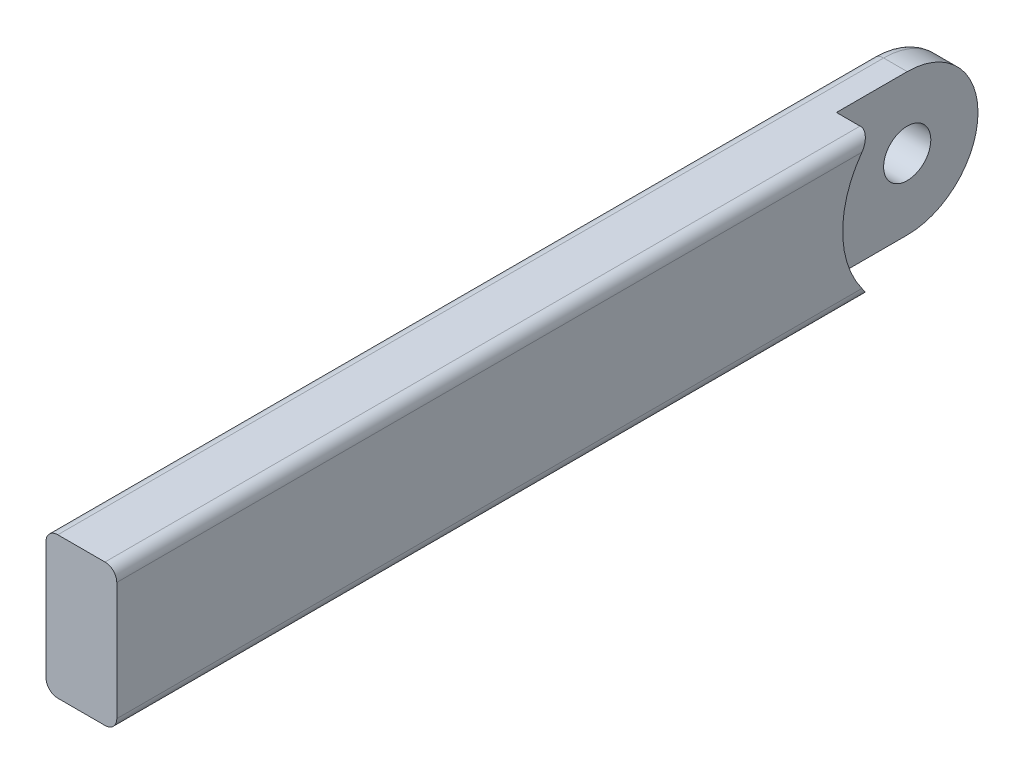
ISO-10303-21;
HEADER;
FILE_DESCRIPTION(('STEP AP214'),'2;1');
FILE_NAME('part.step','',(''),(''),'','','');
FILE_SCHEMA(('AUTOMOTIVE_DESIGN { 1 0 10303 214 1 1 1 1 }'));
ENDSEC;
DATA;
#1=APPLICATION_CONTEXT('core data for automotive mechanical design processes');
#2=APPLICATION_PROTOCOL_DEFINITION('international standard','automotive_design',2000,#1);
#3=PRODUCT_CONTEXT('',#1,'mechanical');
#4=PRODUCT('Part','Part','',(#3));
#5=PRODUCT_RELATED_PRODUCT_CATEGORY('part','',(#4));
#6=PRODUCT_DEFINITION_FORMATION('','',#4);
#7=PRODUCT_DEFINITION_CONTEXT('part definition',#1,'design');
#8=PRODUCT_DEFINITION('design','',#6,#7);
#9=PRODUCT_DEFINITION_SHAPE('','',#8);
#10=(LENGTH_UNIT() NAMED_UNIT(*) SI_UNIT(.MILLI.,.METRE.));
#11=(NAMED_UNIT(*) PLANE_ANGLE_UNIT() SI_UNIT($,.RADIAN.));
#12=(NAMED_UNIT(*) SI_UNIT($,.STERADIAN.) SOLID_ANGLE_UNIT());
#13=UNCERTAINTY_MEASURE_WITH_UNIT(LENGTH_MEASURE(1.E-05),#10,'distance_accuracy_value','');
#14=(GEOMETRIC_REPRESENTATION_CONTEXT(3) GLOBAL_UNCERTAINTY_ASSIGNED_CONTEXT((#13)) GLOBAL_UNIT_ASSIGNED_CONTEXT((#10,
#11,#12)) REPRESENTATION_CONTEXT('',''));
#15=CARTESIAN_POINT('',(0.,0.,0.));
#16=DIRECTION('',(0.,0.,1.));
#17=DIRECTION('',(1.,0.,0.));
#18=AXIS2_PLACEMENT_3D('',#15,#16,#17);
#19=CARTESIAN_POINT('',(0.,0.,0.101351351351291));
#20=DIRECTION('',(0.,0.,-1.));
#21=DIRECTION('',(-1.,0.,0.));
#22=AXIS2_PLACEMENT_3D('',#19,#20,#21);
#23=PLANE('',#22);
#24=DIRECTION('',(-1.,0.,0.));
#25=VECTOR('',#24,1.);
#26=CARTESIAN_POINT('',(11.0472972972973,0.0525401307242337,0.101351351351291));
#27=LINE('',#26,#25);
#28=CARTESIAN_POINT('',(-18.9527027027027,0.0525401307242337,0.101351351351291));
#29=VERTEX_POINT('',#28);
#30=CARTESIAN_POINT('',(-13.4428594049291,0.0525401307242337,0.101351351351291));
#31=VERTEX_POINT('',#30);
#32=EDGE_CURVE('E139',#29,#31,#27,.F.);
#33=ORIENTED_EDGE('',*,*,#32,.T.);
#34=CARTESIAN_POINT('',(-13.9527027027027,2.5,0.101351351351291));
#35=DIRECTION('',(0.,0.,-1.));
#36=DIRECTION('',(-1.,0.,0.));
#37=AXIS2_PLACEMENT_3D('',#34,#35,#36);
#38=CIRCLE('',#37,2.5);
#39=CARTESIAN_POINT('',(-13.9527027027027,0.,0.101351351351291));
#40=VERTEX_POINT('',#39);
#41=EDGE_CURVE('E314',#31,#40,#38,.T.);
#42=ORIENTED_EDGE('',*,*,#41,.T.);
#43=DIRECTION('',(-1.,0.,0.));
#44=VECTOR('',#43,1.);
#45=CARTESIAN_POINT('',(-11.4527027027027,0.,0.101351351351291));
#46=LINE('',#45,#44);
#47=CARTESIAN_POINT('',(-18.9527027027027,0.,0.101351351351291));
#48=VERTEX_POINT('',#47);
#49=EDGE_CURVE('E155',#40,#48,#46,.T.);
#50=ORIENTED_EDGE('',*,*,#49,.T.);
#51=DIRECTION('',(0.,1.,0.));
#52=VECTOR('',#51,1.);
#53=CARTESIAN_POINT('',(-18.9527027027027,30.,0.101351351351291));
#54=LINE('',#53,#52);
#55=EDGE_CURVE('E154',#48,#29,#54,.T.);
#56=ORIENTED_EDGE('',*,*,#55,.T.);
#57=EDGE_LOOP('',(#33,#42,#50,#56));
#58=FACE_BOUND('',#57,.T.);
#59=ADVANCED_FACE('F32',(#58),#23,.T.);
#60=DIRECTION('',(1.,0.,0.));
#61=VECTOR('',#60,1.);
#62=CARTESIAN_POINT('',(-11.4527027027027,30.,0.101351351351291));
#63=LINE('',#62,#61);
#64=CARTESIAN_POINT('',(-18.9527027027027,30.,0.101351351351291));
#65=VERTEX_POINT('',#64);
#66=CARTESIAN_POINT('',(-13.9527027027027,30.,0.101351351351291));
#67=VERTEX_POINT('',#66);
#68=EDGE_CURVE('E157',#65,#67,#63,.T.);
#69=ORIENTED_EDGE('',*,*,#68,.T.);
#70=CARTESIAN_POINT('',(-13.9527027027027,27.5,0.101351351351291));
#71=DIRECTION('',(0.,0.,-1.));
#72=DIRECTION('',(-1.,0.,0.));
#73=AXIS2_PLACEMENT_3D('',#70,#71,#72);
#74=CIRCLE('',#73,2.5);
#75=CARTESIAN_POINT('',(-13.4428594049291,29.9474598692758,0.101351351351291));
#76=VERTEX_POINT('',#75);
#77=EDGE_CURVE('E11',#67,#76,#74,.T.);
#78=ORIENTED_EDGE('',*,*,#77,.T.);
#79=DIRECTION('',(-1.,0.,0.));
#80=VECTOR('',#79,1.);
#81=CARTESIAN_POINT('',(11.0472972972973,29.9474598692758,0.101351351351291));
#82=LINE('',#81,#80);
#83=CARTESIAN_POINT('',(-18.9527027027027,29.9474598692758,0.101351351351291));
#84=VERTEX_POINT('',#83);
#85=EDGE_CURVE('E132',#76,#84,#82,.T.);
#86=ORIENTED_EDGE('',*,*,#85,.T.);
#87=EDGE_CURVE('E137',#84,#65,#54,.T.);
#88=ORIENTED_EDGE('',*,*,#87,.T.);
#89=EDGE_LOOP('',(#69,#78,#86,#88));
#90=FACE_BOUND('',#89,.T.);
#91=ADVANCED_FACE('F135',(#90),#23,.T.);
#92=CARTESIAN_POINT('',(-11.4527027027027,30.,-29.8986486486487));
#93=DIRECTION('',(-1.,0.,0.));
#94=DIRECTION('',(0.,0.,1.));
#95=AXIS2_PLACEMENT_3D('',#92,#93,#94);
#96=PLANE('',#95);
#97=DIRECTION('',(0.,-1.,0.));
#98=VECTOR('',#97,1.);
#99=CARTESIAN_POINT('',(-11.4527027027027,30.,160.101351351351));
#100=LINE('',#99,#98);
#101=CARTESIAN_POINT('',(-11.4527027027027,27.5,160.101351351351));
#102=VERTEX_POINT('',#101);
#103=CARTESIAN_POINT('',(-11.4527027027027,2.5,160.101351351351));
#104=VERTEX_POINT('',#103);
#105=EDGE_CURVE('E171',#102,#104,#100,.T.);
#106=ORIENTED_EDGE('',*,*,#105,.T.);
#107=DIRECTION('',(0.,0.,-1.));
#108=VECTOR('',#107,1.);
#109=CARTESIAN_POINT('',(-11.4527027027027,2.5,-29.8986486486487));
#110=LINE('',#109,#108);
#111=CARTESIAN_POINT('',(-11.4527027027027,2.5,2.19452415641032));
#112=VERTEX_POINT('',#111);
#113=EDGE_CURVE('E219',#104,#112,#110,.T.);
#114=ORIENTED_EDGE('',*,*,#113,.T.);
#115=CARTESIAN_POINT('',(-11.4527027027027,15.,-14.8986486486487));
#116=DIRECTION('',(-1.,0.,0.));
#117=DIRECTION('',(0.,0.,1.));
#118=AXIS2_PLACEMENT_3D('',#115,#116,#117);
#119=CIRCLE('',#118,21.176084542323);
#120=CARTESIAN_POINT('',(-11.4527027027027,27.5,2.19452415641031));
#121=VERTEX_POINT('',#120);
#122=EDGE_CURVE('E147',#121,#112,#119,.F.);
#123=ORIENTED_EDGE('',*,*,#122,.F.);
#124=DIRECTION('',(0.,0.,-1.));
#125=VECTOR('',#124,1.);
#126=CARTESIAN_POINT('',(-11.4527027027027,27.5,160.101351351351));
#127=LINE('',#126,#125);
#128=EDGE_CURVE('E217',#121,#102,#127,.F.);
#129=ORIENTED_EDGE('',*,*,#128,.T.);
#130=EDGE_LOOP('',(#106,#114,#123,#129));
#131=FACE_BOUND('',#130,.T.);
#132=ADVANCED_FACE('F265',(#131),#96,.F.);
#133=CARTESIAN_POINT('',(-26.4527027027027,30.,-29.8986486486487));
#134=DIRECTION('',(1.,0.,0.));
#135=DIRECTION('',(0.,0.,-1.));
#136=AXIS2_PLACEMENT_3D('',#133,#134,#135);
#137=PLANE('',#136);
#138=CARTESIAN_POINT('',(-26.4527027027027,15.,-14.8986486486487));
#139=DIRECTION('',(1.,0.,0.));
#140=DIRECTION('',(0.,0.,-1.));
#141=AXIS2_PLACEMENT_3D('',#138,#139,#140);
#142=CIRCLE('',#141,5.);
#143=CARTESIAN_POINT('',(-26.4527027027027,15.,-19.8986486486487));
#144=VERTEX_POINT('',#143);
#145=EDGE_CURVE('E158',#144,#144,#142,.T.);
#146=ORIENTED_EDGE('',*,*,#145,.T.);
#147=EDGE_LOOP('',(#146));
#148=FACE_BOUND('',#147,.T.);
#149=CARTESIAN_POINT('',(-26.4527027027027,15.,-14.8986486486487));
#150=DIRECTION('',(1.,0.,0.));
#151=DIRECTION('',(0.,0.,-1.));
#152=AXIS2_PLACEMENT_3D('',#149,#150,#151);
#153=CIRCLE('',#152,12.5);
#154=CARTESIAN_POINT('',(-26.4527027027027,15.,-27.3986486486487));
#155=VERTEX_POINT('',#154);
#156=CARTESIAN_POINT('',(-26.4527027027027,2.5,-14.8986486486487));
#157=VERTEX_POINT('',#156);
#158=EDGE_CURVE('E196',#155,#157,#153,.F.);
#159=ORIENTED_EDGE('',*,*,#158,.T.);
#160=DIRECTION('',(0.,0.,1.));
#161=VECTOR('',#160,1.);
#162=CARTESIAN_POINT('',(-26.4527027027027,2.5,-29.8986486486487));
#163=LINE('',#162,#161);
#164=CARTESIAN_POINT('',(-26.4527027027027,2.5,160.101351351351));
#165=VERTEX_POINT('',#164);
#166=EDGE_CURVE('E198',#157,#165,#163,.T.);
#167=ORIENTED_EDGE('',*,*,#166,.T.);
#168=DIRECTION('',(0.,-1.,0.));
#169=VECTOR('',#168,1.);
#170=CARTESIAN_POINT('',(-26.4527027027027,30.,160.101351351351));
#171=LINE('',#170,#169);
#172=CARTESIAN_POINT('',(-26.4527027027027,27.5,160.101351351351));
#173=VERTEX_POINT('',#172);
#174=EDGE_CURVE('E176',#173,#165,#171,.T.);
#175=ORIENTED_EDGE('',*,*,#174,.F.);
#176=DIRECTION('',(0.,0.,1.));
#177=VECTOR('',#176,1.);
#178=CARTESIAN_POINT('',(-26.4527027027027,27.5,-14.8986486486487));
#179=LINE('',#178,#177);
#180=CARTESIAN_POINT('',(-26.4527027027027,27.5,-14.8986486486487));
#181=VERTEX_POINT('',#180);
#182=EDGE_CURVE('E192',#173,#181,#179,.F.);
#183=ORIENTED_EDGE('',*,*,#182,.T.);
#184=CARTESIAN_POINT('',(-26.4527027027027,15.,-14.8986486486487));
#185=DIRECTION('',(1.,0.,0.));
#186=DIRECTION('',(0.,0.,-1.));
#187=AXIS2_PLACEMENT_3D('',#184,#185,#186);
#188=CIRCLE('',#187,12.5);
#189=EDGE_CURVE('E194',#181,#155,#188,.F.);
#190=ORIENTED_EDGE('',*,*,#189,.T.);
#191=EDGE_LOOP('',(#159,#167,#175,#183,#190));
#192=FACE_BOUND('',#191,.T.);
#193=ADVANCED_FACE('F261',(#148,#192),#137,.F.);
#194=CARTESIAN_POINT('',(-26.4527027027027,30.,160.101351351351));
#195=DIRECTION('',(0.,0.,-1.));
#196=DIRECTION('',(-1.,0.,0.));
#197=AXIS2_PLACEMENT_3D('',#194,#195,#196);
#198=PLANE('',#197);
#199=ORIENTED_EDGE('',*,*,#174,.T.);
#200=CARTESIAN_POINT('',(-23.9527027027027,2.5,160.101351351351));
#201=DIRECTION('',(0.,0.,-1.));
#202=DIRECTION('',(-1.,0.,0.));
#203=AXIS2_PLACEMENT_3D('',#200,#201,#202);
#204=CIRCLE('',#203,2.5);
#205=CARTESIAN_POINT('',(-23.9527027027027,0.,160.101351351351));
#206=VERTEX_POINT('',#205);
#207=EDGE_CURVE('E207',#165,#206,#204,.F.);
#208=ORIENTED_EDGE('',*,*,#207,.T.);
#209=DIRECTION('',(1.,0.,0.));
#210=VECTOR('',#209,1.);
#211=CARTESIAN_POINT('',(-26.4527027027027,0.,160.101351351351));
#212=LINE('',#211,#210);
#213=CARTESIAN_POINT('',(-13.9527027027027,0.,160.101351351351));
#214=VERTEX_POINT('',#213);
#215=EDGE_CURVE('E165',#206,#214,#212,.T.);
#216=ORIENTED_EDGE('',*,*,#215,.T.);
#217=CARTESIAN_POINT('',(-13.9527027027027,2.5,160.101351351351));
#218=DIRECTION('',(0.,0.,-1.));
#219=DIRECTION('',(-1.,0.,0.));
#220=AXIS2_PLACEMENT_3D('',#217,#218,#219);
#221=CIRCLE('',#220,2.5);
#222=EDGE_CURVE('E205',#214,#104,#221,.F.);
#223=ORIENTED_EDGE('',*,*,#222,.T.);
#224=ORIENTED_EDGE('',*,*,#105,.F.);
#225=CARTESIAN_POINT('',(-13.9527027027027,27.5,160.101351351351));
#226=DIRECTION('',(0.,0.,-1.));
#227=DIRECTION('',(-1.,0.,0.));
#228=AXIS2_PLACEMENT_3D('',#225,#226,#227);
#229=CIRCLE('',#228,2.5);
#230=CARTESIAN_POINT('',(-13.9527027027027,30.,160.101351351351));
#231=VERTEX_POINT('',#230);
#232=EDGE_CURVE('E201',#102,#231,#229,.F.);
#233=ORIENTED_EDGE('',*,*,#232,.T.);
#234=DIRECTION('',(1.,0.,0.));
#235=VECTOR('',#234,1.);
#236=CARTESIAN_POINT('',(-26.4527027027027,30.,160.101351351351));
#237=LINE('',#236,#235);
#238=CARTESIAN_POINT('',(-23.9527027027027,30.,160.101351351351));
#239=VERTEX_POINT('',#238);
#240=EDGE_CURVE('E168',#239,#231,#237,.T.);
#241=ORIENTED_EDGE('',*,*,#240,.F.);
#242=CARTESIAN_POINT('',(-23.9527027027027,27.5,160.101351351351));
#243=DIRECTION('',(0.,0.,-1.));
#244=DIRECTION('',(-1.,0.,0.));
#245=AXIS2_PLACEMENT_3D('',#242,#243,#244);
#246=CIRCLE('',#245,2.5);
#247=EDGE_CURVE('E203',#239,#173,#246,.F.);
#248=ORIENTED_EDGE('',*,*,#247,.T.);
#249=EDGE_LOOP('',(#199,#208,#216,#223,#224,#233,#241,#248));
#250=FACE_BOUND('',#249,.T.);
#251=ADVANCED_FACE('F254',(#250),#198,.F.);
#252=CARTESIAN_POINT('',(0.,30.,0.));
#253=DIRECTION('',(0.,1.,0.));
#254=DIRECTION('',(0.,0.,1.));
#255=AXIS2_PLACEMENT_3D('',#252,#253,#254);
#256=PLANE('',#255);
#257=DIRECTION('',(-1.,0.,0.));
#258=VECTOR('',#257,1.);
#259=CARTESIAN_POINT('',(-26.4527027027027,30.,-14.8986486486487));
#260=LINE('',#259,#258);
#261=CARTESIAN_POINT('',(-18.9527027027027,30.,-14.8986486486487));
#262=VERTEX_POINT('',#261);
#263=CARTESIAN_POINT('',(-23.9527027027027,30.,-14.8986486486487));
#264=VERTEX_POINT('',#263);
#265=EDGE_CURVE('E140',#262,#264,#260,.T.);
#266=ORIENTED_EDGE('',*,*,#265,.T.);
#267=DIRECTION('',(0.,0.,1.));
#268=VECTOR('',#267,1.);
#269=CARTESIAN_POINT('',(-23.9527027027027,30.,160.101351351351));
#270=LINE('',#269,#268);
#271=EDGE_CURVE('E42',#264,#239,#270,.T.);
#272=ORIENTED_EDGE('',*,*,#271,.T.);
#273=ORIENTED_EDGE('',*,*,#240,.T.);
#274=DIRECTION('',(0.,0.,-1.));
#275=VECTOR('',#274,1.);
#276=CARTESIAN_POINT('',(-13.9527027027027,30.,0.101351351351292));
#277=LINE('',#276,#275);
#278=EDGE_CURVE('E306',#231,#67,#277,.T.);
#279=ORIENTED_EDGE('',*,*,#278,.T.);
#280=ORIENTED_EDGE('',*,*,#68,.F.);
#281=DIRECTION('',(0.,0.,-1.));
#282=VECTOR('',#281,1.);
#283=CARTESIAN_POINT('',(-18.9527027027027,30.,0.101351351351291));
#284=LINE('',#283,#282);
#285=EDGE_CURVE('E152',#65,#262,#284,.T.);
#286=ORIENTED_EDGE('',*,*,#285,.T.);
#287=EDGE_LOOP('',(#266,#272,#273,#279,#280,#286));
#288=FACE_BOUND('',#287,.T.);
#289=ADVANCED_FACE('F251',(#288),#256,.T.);
#290=CARTESIAN_POINT('',(0.,0.,0.));
#291=DIRECTION('',(0.,1.,0.));
#292=DIRECTION('',(0.,0.,1.));
#293=AXIS2_PLACEMENT_3D('',#290,#291,#292);
#294=PLANE('',#293);
#295=ORIENTED_EDGE('',*,*,#215,.F.);
#296=DIRECTION('',(0.,0.,1.));
#297=VECTOR('',#296,1.);
#298=CARTESIAN_POINT('',(-23.9527027027027,0.,0.));
#299=LINE('',#298,#297);
#300=CARTESIAN_POINT('',(-23.9527027027027,0.,-14.8986486486487));
#301=VERTEX_POINT('',#300);
#302=EDGE_CURVE('E211',#206,#301,#299,.F.);
#303=ORIENTED_EDGE('',*,*,#302,.T.);
#304=DIRECTION('',(-1.,0.,0.));
#305=VECTOR('',#304,1.);
#306=CARTESIAN_POINT('',(0.,0.,-14.8986486486487));
#307=LINE('',#306,#305);
#308=CARTESIAN_POINT('',(-18.9527027027027,0.,-14.8986486486487));
#309=VERTEX_POINT('',#308);
#310=EDGE_CURVE('E179',#301,#309,#307,.F.);
#311=ORIENTED_EDGE('',*,*,#310,.T.);
#312=DIRECTION('',(0.,0.,-1.));
#313=VECTOR('',#312,1.);
#314=CARTESIAN_POINT('',(-18.9527027027027,0.,0.101351351351291));
#315=LINE('',#314,#313);
#316=EDGE_CURVE('E163',#48,#309,#315,.T.);
#317=ORIENTED_EDGE('',*,*,#316,.F.);
#318=ORIENTED_EDGE('',*,*,#49,.F.);
#319=DIRECTION('',(0.,0.,-1.));
#320=VECTOR('',#319,1.);
#321=CARTESIAN_POINT('',(-13.9527027027027,0.,0.));
#322=LINE('',#321,#320);
#323=EDGE_CURVE('E209',#40,#214,#322,.F.);
#324=ORIENTED_EDGE('',*,*,#323,.T.);
#325=EDGE_LOOP('',(#295,#303,#311,#317,#318,#324));
#326=FACE_BOUND('',#325,.T.);
#327=ADVANCED_FACE('F250',(#326),#294,.F.);
#328=CARTESIAN_POINT('',(-18.9527027027027,30.,0.101351351351291));
#329=DIRECTION('',(-1.,0.,0.));
#330=DIRECTION('',(0.,0.,1.));
#331=AXIS2_PLACEMENT_3D('',#328,#329,#330);
#332=PLANE('',#331);
#333=ORIENTED_EDGE('',*,*,#87,.F.);
#334=CARTESIAN_POINT('',(-18.9527027027027,15.,-14.8986486486487));
#335=DIRECTION('',(1.,0.,0.));
#336=DIRECTION('',(0.,0.,-1.));
#337=AXIS2_PLACEMENT_3D('',#334,#335,#336);
#338=CIRCLE('',#337,21.176084542323);
#339=EDGE_CURVE('E142',#84,#29,#338,.T.);
#340=ORIENTED_EDGE('',*,*,#339,.T.);
#341=ORIENTED_EDGE('',*,*,#55,.F.);
#342=ORIENTED_EDGE('',*,*,#316,.T.);
#343=CARTESIAN_POINT('',(-18.9527027027027,15.,-14.8986486486487));
#344=DIRECTION('',(-1.,0.,0.));
#345=DIRECTION('',(0.,0.,1.));
#346=AXIS2_PLACEMENT_3D('',#343,#344,#345);
#347=CIRCLE('',#346,15.);
#348=CARTESIAN_POINT('',(-18.9527027027027,15.,-29.8986486486487));
#349=VERTEX_POINT('',#348);
#350=EDGE_CURVE('E183',#309,#349,#347,.F.);
#351=ORIENTED_EDGE('',*,*,#350,.T.);
#352=CARTESIAN_POINT('',(-18.9527027027027,15.,-14.8986486486487));
#353=DIRECTION('',(-1.,0.,0.));
#354=DIRECTION('',(0.,0.,1.));
#355=AXIS2_PLACEMENT_3D('',#352,#353,#354);
#356=CIRCLE('',#355,15.);
#357=EDGE_CURVE('E181',#349,#262,#356,.F.);
#358=ORIENTED_EDGE('',*,*,#357,.T.);
#359=ORIENTED_EDGE('',*,*,#285,.F.);
#360=EDGE_LOOP('',(#333,#340,#341,#342,#351,#358,#359));
#361=FACE_BOUND('',#360,.T.);
#362=CARTESIAN_POINT('',(-18.9527027027027,15.,-14.8986486486487));
#363=DIRECTION('',(1.,0.,0.));
#364=DIRECTION('',(0.,0.,-1.));
#365=AXIS2_PLACEMENT_3D('',#362,#363,#364);
#366=CIRCLE('',#365,5.);
#367=CARTESIAN_POINT('',(-18.9527027027027,15.,-19.8986486486487));
#368=VERTEX_POINT('',#367);
#369=EDGE_CURVE('E189',#368,#368,#366,.T.);
#370=ORIENTED_EDGE('',*,*,#369,.F.);
#371=EDGE_LOOP('',(#370));
#372=FACE_BOUND('',#371,.T.);
#373=ADVANCED_FACE('F149',(#361,#372),#332,.F.);
#374=CARTESIAN_POINT('',(-48.9527027027027,15.,-14.8986486486487));
#375=DIRECTION('',(1.,0.,0.));
#376=DIRECTION('',(0.,0.,-1.));
#377=AXIS2_PLACEMENT_3D('',#374,#375,#376);
#378=CYLINDRICAL_SURFACE('',#377,5.);
#379=ORIENTED_EDGE('',*,*,#369,.T.);
#380=EDGE_LOOP('',(#379));
#381=FACE_BOUND('',#380,.T.);
#382=ORIENTED_EDGE('',*,*,#145,.F.);
#383=EDGE_LOOP('',(#382));
#384=FACE_BOUND('',#383,.T.);
#385=ADVANCED_FACE('F239',(#381,#384),#378,.F.);
#386=CARTESIAN_POINT('',(0.,15.,-14.8986486486487));
#387=DIRECTION('',(1.,0.,0.));
#388=DIRECTION('',(0.,0.,-1.));
#389=AXIS2_PLACEMENT_3D('',#386,#387,#388);
#390=CYLINDRICAL_SURFACE('',#389,15.);
#391=DIRECTION('',(-1.,0.,0.));
#392=VECTOR('',#391,1.);
#393=CARTESIAN_POINT('',(-18.9527027027027,15.,-29.8986486486487));
#394=LINE('',#393,#392);
#395=CARTESIAN_POINT('',(-23.9527027027027,15.,-29.8986486486487));
#396=VERTEX_POINT('',#395);
#397=EDGE_CURVE('E188',#396,#349,#394,.F.);
#398=ORIENTED_EDGE('',*,*,#397,.F.);
#399=CARTESIAN_POINT('',(-23.9527027027027,15.,-14.8986486486487));
#400=DIRECTION('',(1.,0.,0.));
#401=DIRECTION('',(0.,0.,-1.));
#402=AXIS2_PLACEMENT_3D('',#399,#400,#401);
#403=CIRCLE('',#402,15.);
#404=EDGE_CURVE('E215',#396,#264,#403,.T.);
#405=ORIENTED_EDGE('',*,*,#404,.T.);
#406=ORIENTED_EDGE('',*,*,#265,.F.);
#407=ORIENTED_EDGE('',*,*,#357,.F.);
#408=EDGE_LOOP('',(#398,#405,#406,#407));
#409=FACE_BOUND('',#408,.T.);
#410=ADVANCED_FACE('F243',(#409),#390,.T.);
#411=CARTESIAN_POINT('',(-26.4527027027027,15.,-14.8986486486487));
#412=DIRECTION('',(-1.,0.,0.));
#413=DIRECTION('',(0.,0.,1.));
#414=AXIS2_PLACEMENT_3D('',#411,#412,#413);
#415=CYLINDRICAL_SURFACE('',#414,15.);
#416=ORIENTED_EDGE('',*,*,#310,.F.);
#417=CARTESIAN_POINT('',(-23.9527027027027,15.,-14.8986486486487));
#418=DIRECTION('',(1.,0.,0.));
#419=DIRECTION('',(0.,0.,-1.));
#420=AXIS2_PLACEMENT_3D('',#417,#418,#419);
#421=CIRCLE('',#420,15.);
#422=EDGE_CURVE('E213',#301,#396,#421,.T.);
#423=ORIENTED_EDGE('',*,*,#422,.T.);
#424=ORIENTED_EDGE('',*,*,#397,.T.);
#425=ORIENTED_EDGE('',*,*,#350,.F.);
#426=EDGE_LOOP('',(#416,#423,#424,#425));
#427=FACE_BOUND('',#426,.T.);
#428=ADVANCED_FACE('F238',(#427),#415,.T.);
#429=CARTESIAN_POINT('',(11.0472972972973,15.,-14.8986486486487));
#430=DIRECTION('',(-1.,0.,0.));
#431=DIRECTION('',(0.,0.,1.));
#432=AXIS2_PLACEMENT_3D('',#429,#430,#431);
#433=CYLINDRICAL_SURFACE('',#432,21.176084542323);
#434=ORIENTED_EDGE('',*,*,#122,.T.);
#435=CARTESIAN_POINT('',(-11.4527027027027,2.5,2.19452415641032));
#436=CARTESIAN_POINT('',(-11.4527117214096,2.41465524404312,2.13212108162011));
#437=CARTESIAN_POINT('',(-11.4570726743684,2.32980306821963,2.06908075989872));
#438=CARTESIAN_POINT('',(-11.4742664777298,2.16160583040771,1.94217124943293));
#439=CARTESIAN_POINT('',(-11.4870981320158,2.07826055734193,1.87830217896121));
#440=CARTESIAN_POINT('',(-11.5211101375047,1.91304698576908,1.74975233138851));
#441=CARTESIAN_POINT('',(-11.5423434656319,1.83119157574843,1.68506897549738));
#442=CARTESIAN_POINT('',(-11.592988862302,1.67000795843048,1.55579045620666));
#443=CARTESIAN_POINT('',(-11.6224014193902,1.59067990240756,1.4911952983068));
#444=CARTESIAN_POINT('',(-11.7252323209314,1.35140365271457,1.29351057117169));
#445=CARTESIAN_POINT('',(-11.8120126615188,1.19624843050647,1.16126992784146));
#446=CARTESIAN_POINT('',(-12.0203698286765,0.903668040457371,0.905072959632136));
#447=CARTESIAN_POINT('',(-12.1418718757572,0.766205680841045,0.781099530008149));
#448=CARTESIAN_POINT('',(-12.3703708329966,0.560780400461255,0.591590692402536));
#449=CARTESIAN_POINT('',(-12.4668151098135,0.485624051123047,0.52109631279494));
#450=CARTESIAN_POINT('',(-12.674197744159,0.348066511291644,0.390442588950423));
#451=CARTESIAN_POINT('',(-12.7850713959926,0.285611391024147,0.330239728104617));
#452=CARTESIAN_POINT('',(-12.9862545041543,0.19253480243874,0.239662860593336));
#453=CARTESIAN_POINT('',(-13.0731056467113,0.157944084036737,0.205713116631951));
#454=CARTESIAN_POINT('',(-13.253385142039,0.0978984887050709,0.146472576671493));
#455=CARTESIAN_POINT('',(-13.3468534372769,0.0725059740977172,0.121240939296582));
#456=CARTESIAN_POINT('',(-13.4428594049292,0.052540130724234,0.10135135135129));
#457=B_SPLINE_CURVE_WITH_KNOTS('',3,(#435,#436,#437,#438,#439,#440,#441,#442,#443,#444,#445,
#446,#447,#448,#449,#450,#451,#452,#453,#454,#455,#456),.UNSPECIFIED.,.F.,.F.,(4,2,2,2,2,2,2,2,
2,2,4),(0.,0.317051425084085,0.634058090073179,0.953096341918466,1.27215365400816,
1.93343726213751,2.59330727295348,3.01537270814065,3.4356067978222,3.73304196742588,
4.03245753846565),.UNSPECIFIED.);
#458=EDGE_CURVE('E56',#112,#31,#457,.T.);
#459=ORIENTED_EDGE('',*,*,#458,.T.);
#460=ORIENTED_EDGE('',*,*,#32,.F.);
#461=ORIENTED_EDGE('',*,*,#339,.F.);
#462=ORIENTED_EDGE('',*,*,#85,.F.);
#463=CARTESIAN_POINT('',(-13.4428594049291,29.9474598692758,0.101351351351291));
#464=CARTESIAN_POINT('',(-13.3788793129982,29.9341393562226,0.114623265711844));
#465=CARTESIAN_POINT('',(-13.3159679734647,29.918408818079,0.130265405850267));
#466=CARTESIAN_POINT('',(-13.1927651874353,29.8825605307811,0.165766324989154));
#467=CARTESIAN_POINT('',(-13.1324690109039,29.8624511355518,0.185617072988808));
#468=CARTESIAN_POINT('',(-12.9572238728552,29.7966210649916,0.250288613137615));
#469=CARTESIAN_POINT('',(-12.8464301856296,29.7450724326239,0.300557768400987));
#470=CARTESIAN_POINT('',(-12.6148044950149,29.6168917021403,0.423966220476915));
#471=CARTESIAN_POINT('',(-12.4970822456273,29.5372390167341,0.499702993523758));
#472=CARTESIAN_POINT('',(-12.2803602298367,29.3635107291712,0.66189005181299));
#473=CARTESIAN_POINT('',(-12.1814627980436,29.2693610599338,0.748394891277271));
#474=CARTESIAN_POINT('',(-11.9764824753478,29.0409368361624,0.954065540980285));
#475=CARTESIAN_POINT('',(-11.8767076232392,28.9029657126696,1.07540184332051));
#476=CARTESIAN_POINT('',(-11.7081217795849,28.6135046358826,1.32279876892711));
#477=CARTESIAN_POINT('',(-11.6392916731709,28.4620230976028,1.44885642348621));
#478=CARTESIAN_POINT('',(-11.5421375017619,28.1765446673366,1.67943164543804));
#479=CARTESIAN_POINT('',(-11.5088224067095,28.0441497066756,1.7838438249992));
#480=CARTESIAN_POINT('',(-11.4752943297522,27.8421893694024,1.93916433630576));
#481=CARTESIAN_POINT('',(-11.4668593020381,27.7743753081243,1.99067224034898));
#482=CARTESIAN_POINT('',(-11.4555654265777,27.6378183023383,2.09309659207128));
#483=CARTESIAN_POINT('',(-11.4527079077388,27.5690751403887,2.14401289592275));
#484=CARTESIAN_POINT('',(-11.4527027027027,27.5,2.19452415641032));
#485=B_SPLINE_CURVE_WITH_KNOTS('',3,(#463,#464,#465,#466,#467,#468,#469,#470,#471,#472,#473,
#474,#475,#476,#477,#478,#479,#480,#481,#482,#483,#484),.UNSPECIFIED.,.F.,.F.,(4,2,2,2,2,2,2,2,
2,2,4),(0.,0.199847288032903,0.399316599302326,0.793656678193518,1.27429952009711,
1.75748492228142,2.38150989694563,3.00514887394757,3.51925506785213,3.77581121796464,
4.03242848815572),.UNSPECIFIED.);
#486=EDGE_CURVE('E222',#76,#121,#485,.T.);
#487=ORIENTED_EDGE('',*,*,#486,.T.);
#488=EDGE_LOOP('',(#434,#459,#460,#461,#462,#487));
#489=FACE_BOUND('',#488,.T.);
#490=ADVANCED_FACE('F143',(#489),#433,.F.);
#491=CARTESIAN_POINT('',(-23.9527027027027,27.5,0.));
#492=DIRECTION('',(0.,0.,-1.));
#493=DIRECTION('',(-1.,0.,0.));
#494=AXIS2_PLACEMENT_3D('',#491,#492,#493);
#495=CYLINDRICAL_SURFACE('',#494,2.5);
#496=ORIENTED_EDGE('',*,*,#247,.F.);
#497=ORIENTED_EDGE('',*,*,#271,.F.);
#498=CARTESIAN_POINT('',(-23.9527027027027,27.5,-14.8986486486487));
#499=DIRECTION('',(0.,0.,-1.));
#500=DIRECTION('',(-1.,0.,0.));
#501=AXIS2_PLACEMENT_3D('',#498,#499,#500);
#502=CIRCLE('',#501,2.5);
#503=EDGE_CURVE('E37',#181,#264,#502,.T.);
#504=ORIENTED_EDGE('',*,*,#503,.F.);
#505=ORIENTED_EDGE('',*,*,#182,.F.);
#506=EDGE_LOOP('',(#496,#497,#504,#505));
#507=FACE_BOUND('',#506,.T.);
#508=ADVANCED_FACE('F237',(#507),#495,.T.);
#509=CARTESIAN_POINT('',(-23.9527027027027,15.,-14.8986486486487));
#510=DIRECTION('',(1.,0.,0.));
#511=DIRECTION('',(0.,0.,-1.));
#512=AXIS2_PLACEMENT_3D('',#509,#510,#511);
#513=TOROIDAL_SURFACE('',#512,12.5,2.5);
#514=ORIENTED_EDGE('',*,*,#503,.T.);
#515=ORIENTED_EDGE('',*,*,#404,.F.);
#516=CARTESIAN_POINT('',(-23.9527027027027,15.,-27.3986486486487));
#517=DIRECTION('',(0.,-1.,0.));
#518=DIRECTION('',(0.,0.,-1.));
#519=AXIS2_PLACEMENT_3D('',#516,#517,#518);
#520=CIRCLE('',#519,2.5);
#521=EDGE_CURVE('E319',#155,#396,#520,.T.);
#522=ORIENTED_EDGE('',*,*,#521,.F.);
#523=ORIENTED_EDGE('',*,*,#189,.F.);
#524=EDGE_LOOP('',(#514,#515,#522,#523));
#525=FACE_BOUND('',#524,.T.);
#526=ADVANCED_FACE('F284',(#525),#513,.T.);
#527=CARTESIAN_POINT('',(-23.9527027027027,15.,-14.8986486486487));
#528=DIRECTION('',(1.,0.,0.));
#529=DIRECTION('',(0.,0.,-1.));
#530=AXIS2_PLACEMENT_3D('',#527,#528,#529);
#531=TOROIDAL_SURFACE('',#530,12.5,2.5);
#532=ORIENTED_EDGE('',*,*,#521,.T.);
#533=ORIENTED_EDGE('',*,*,#422,.F.);
#534=CARTESIAN_POINT('',(-23.9527027027027,2.5,-14.8986486486487));
#535=DIRECTION('',(0.,0.,1.));
#536=DIRECTION('',(1.,0.,0.));
#537=AXIS2_PLACEMENT_3D('',#534,#535,#536);
#538=CIRCLE('',#537,2.5);
#539=EDGE_CURVE('E317',#157,#301,#538,.T.);
#540=ORIENTED_EDGE('',*,*,#539,.F.);
#541=ORIENTED_EDGE('',*,*,#158,.F.);
#542=EDGE_LOOP('',(#532,#533,#540,#541));
#543=FACE_BOUND('',#542,.T.);
#544=ADVANCED_FACE('F280',(#543),#531,.T.);
#545=CARTESIAN_POINT('',(-23.9527027027027,2.5,-29.8986486486487));
#546=DIRECTION('',(0.,0.,1.));
#547=DIRECTION('',(1.,0.,0.));
#548=AXIS2_PLACEMENT_3D('',#545,#546,#547);
#549=CYLINDRICAL_SURFACE('',#548,2.5);
#550=ORIENTED_EDGE('',*,*,#539,.T.);
#551=ORIENTED_EDGE('',*,*,#302,.F.);
#552=ORIENTED_EDGE('',*,*,#207,.F.);
#553=ORIENTED_EDGE('',*,*,#166,.F.);
#554=EDGE_LOOP('',(#550,#551,#552,#553));
#555=FACE_BOUND('',#554,.T.);
#556=ADVANCED_FACE('F276',(#555),#549,.T.);
#557=CARTESIAN_POINT('',(-13.9527027027027,2.5,-29.8986486486487));
#558=DIRECTION('',(0.,0.,-1.));
#559=DIRECTION('',(-1.,0.,0.));
#560=AXIS2_PLACEMENT_3D('',#557,#558,#559);
#561=CYLINDRICAL_SURFACE('',#560,2.5);
#562=ORIENTED_EDGE('',*,*,#222,.F.);
#563=ORIENTED_EDGE('',*,*,#323,.F.);
#564=ORIENTED_EDGE('',*,*,#41,.F.);
#565=ORIENTED_EDGE('',*,*,#458,.F.);
#566=ORIENTED_EDGE('',*,*,#113,.F.);
#567=EDGE_LOOP('',(#562,#563,#564,#565,#566));
#568=FACE_BOUND('',#567,.T.);
#569=ADVANCED_FACE('F279',(#568),#561,.T.);
#570=CARTESIAN_POINT('',(-13.9527027027027,27.5,0.));
#571=DIRECTION('',(0.,0.,1.));
#572=DIRECTION('',(1.,0.,0.));
#573=AXIS2_PLACEMENT_3D('',#570,#571,#572);
#574=CYLINDRICAL_SURFACE('',#573,2.5);
#575=ORIENTED_EDGE('',*,*,#232,.F.);
#576=ORIENTED_EDGE('',*,*,#128,.F.);
#577=ORIENTED_EDGE('',*,*,#486,.F.);
#578=ORIENTED_EDGE('',*,*,#77,.F.);
#579=ORIENTED_EDGE('',*,*,#278,.F.);
#580=EDGE_LOOP('',(#575,#576,#577,#578,#579));
#581=FACE_BOUND('',#580,.T.);
#582=ADVANCED_FACE('F34',(#581),#574,.T.);
#583=CLOSED_SHELL('',(#59,#91,#132,#193,#251,#289,#327,#373,#385,#410,#428,#490,#508,#526,#544,
#556,#569,#582));
#584=MANIFOLD_SOLID_BREP('B2',#583);
#585=ADVANCED_BREP_SHAPE_REPRESENTATION('',(#18,#584),#14);
#586=SHAPE_DEFINITION_REPRESENTATION(#9,#585);
ENDSEC;
END-ISO-10303-21;
